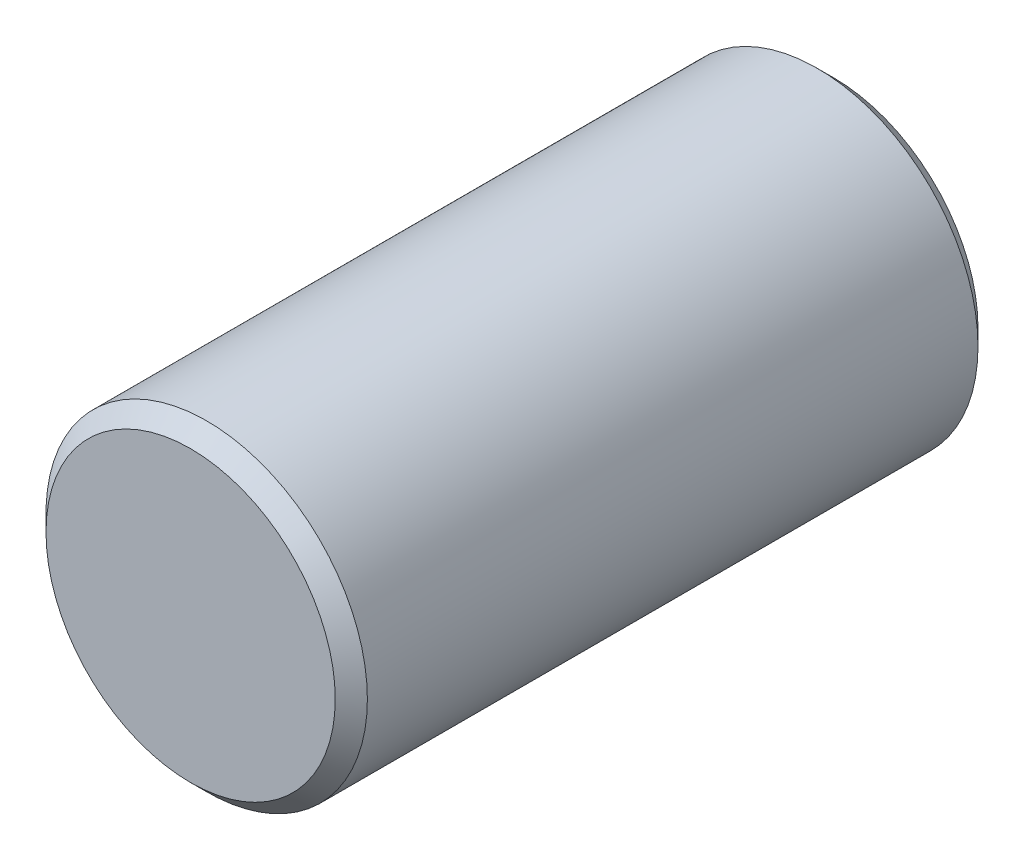
ISO-10303-21;
HEADER;
FILE_DESCRIPTION(('STEP AP214'),'2;1');
FILE_NAME('part.step','',(''),(''),'','','');
FILE_SCHEMA(('AUTOMOTIVE_DESIGN { 1 0 10303 214 1 1 1 1 }'));
ENDSEC;
DATA;
#1=APPLICATION_CONTEXT('core data for automotive mechanical design processes');
#2=APPLICATION_PROTOCOL_DEFINITION('international standard','automotive_design',2000,#1);
#3=PRODUCT_CONTEXT('',#1,'mechanical');
#4=PRODUCT('Part','Part','',(#3));
#5=PRODUCT_RELATED_PRODUCT_CATEGORY('part','',(#4));
#6=PRODUCT_DEFINITION_FORMATION('','',#4);
#7=PRODUCT_DEFINITION_CONTEXT('part definition',#1,'design');
#8=PRODUCT_DEFINITION('design','',#6,#7);
#9=PRODUCT_DEFINITION_SHAPE('','',#8);
#10=(LENGTH_UNIT() NAMED_UNIT(*) SI_UNIT(.MILLI.,.METRE.));
#11=(NAMED_UNIT(*) PLANE_ANGLE_UNIT() SI_UNIT($,.RADIAN.));
#12=(NAMED_UNIT(*) SI_UNIT($,.STERADIAN.) SOLID_ANGLE_UNIT());
#13=UNCERTAINTY_MEASURE_WITH_UNIT(LENGTH_MEASURE(1.E-05),#10,'distance_accuracy_value','');
#14=(GEOMETRIC_REPRESENTATION_CONTEXT(3) GLOBAL_UNCERTAINTY_ASSIGNED_CONTEXT((#13)) GLOBAL_UNIT_ASSIGNED_CONTEXT((#10,
#11,#12)) REPRESENTATION_CONTEXT('',''));
#15=CARTESIAN_POINT('',(0.,0.,0.));
#16=DIRECTION('',(0.,0.,1.));
#17=DIRECTION('',(1.,0.,0.));
#18=AXIS2_PLACEMENT_3D('',#15,#16,#17);
#19=CARTESIAN_POINT('',(0.,0.,4.));
#20=DIRECTION('',(0.,0.,-1.));
#21=DIRECTION('',(-1.,0.,0.));
#22=AXIS2_PLACEMENT_3D('',#19,#20,#21);
#23=CYLINDRICAL_SURFACE('',#22,2.);
#24=CARTESIAN_POINT('',(0.,0.,-3.8));
#25=DIRECTION('',(0.,0.,1.));
#26=DIRECTION('',(1.,0.,0.));
#27=AXIS2_PLACEMENT_3D('',#24,#25,#26);
#28=CIRCLE('',#27,2.);
#29=CARTESIAN_POINT('',(2.,0.,-3.8));
#30=VERTEX_POINT('',#29);
#31=EDGE_CURVE('E47',#30,#30,#28,.T.);
#32=ORIENTED_EDGE('',*,*,#31,.T.);
#33=EDGE_LOOP('',(#32));
#34=FACE_BOUND('',#33,.T.);
#35=CARTESIAN_POINT('',(0.,0.,3.8));
#36=DIRECTION('',(0.,0.,1.));
#37=DIRECTION('',(1.,0.,0.));
#38=AXIS2_PLACEMENT_3D('',#35,#36,#37);
#39=CIRCLE('',#38,2.);
#40=CARTESIAN_POINT('',(2.,0.,3.8));
#41=VERTEX_POINT('',#40);
#42=EDGE_CURVE('E51',#41,#41,#39,.F.);
#43=ORIENTED_EDGE('',*,*,#42,.T.);
#44=EDGE_LOOP('',(#43));
#45=FACE_BOUND('',#44,.T.);
#46=ADVANCED_FACE('F35',(#34,#45),#23,.T.);
#47=CARTESIAN_POINT('',(0.,0.,4.));
#48=DIRECTION('',(0.,0.,1.));
#49=DIRECTION('',(1.,0.,0.));
#50=AXIS2_PLACEMENT_3D('',#47,#48,#49);
#51=PLANE('',#50);
#52=CARTESIAN_POINT('',(0.,0.,4.));
#53=DIRECTION('',(0.,0.,1.));
#54=DIRECTION('',(1.,0.,0.));
#55=AXIS2_PLACEMENT_3D('',#52,#53,#54);
#56=CIRCLE('',#55,1.8);
#57=CARTESIAN_POINT('',(1.8,0.,4.));
#58=VERTEX_POINT('',#57);
#59=EDGE_CURVE('E10',#58,#58,#56,.T.);
#60=ORIENTED_EDGE('',*,*,#59,.T.);
#61=EDGE_LOOP('',(#60));
#62=FACE_BOUND('',#61,.T.);
#63=ADVANCED_FACE('F67',(#62),#51,.T.);
#64=CARTESIAN_POINT('',(0.,0.,-4.));
#65=DIRECTION('',(0.,0.,1.));
#66=DIRECTION('',(1.,0.,0.));
#67=AXIS2_PLACEMENT_3D('',#64,#65,#66);
#68=PLANE('',#67);
#69=CARTESIAN_POINT('',(0.,0.,-4.));
#70=DIRECTION('',(0.,0.,1.));
#71=DIRECTION('',(1.,0.,0.));
#72=AXIS2_PLACEMENT_3D('',#69,#70,#71);
#73=CIRCLE('',#72,1.8);
#74=CARTESIAN_POINT('',(1.8,0.,-4.));
#75=VERTEX_POINT('',#74);
#76=EDGE_CURVE('E43',#75,#75,#73,.F.);
#77=ORIENTED_EDGE('',*,*,#76,.T.);
#78=EDGE_LOOP('',(#77));
#79=FACE_BOUND('',#78,.T.);
#80=ADVANCED_FACE('F64',(#79),#68,.F.);
#81=CARTESIAN_POINT('',(0.,0.,-3.8));
#82=DIRECTION('',(0.,0.,1.));
#83=DIRECTION('',(1.,0.,0.));
#84=AXIS2_PLACEMENT_3D('',#81,#82,#83);
#85=CONICAL_SURFACE('',#84,2.,0.785398163397448);
#86=ORIENTED_EDGE('',*,*,#76,.F.);
#87=EDGE_LOOP('',(#86));
#88=FACE_BOUND('',#87,.T.);
#89=ORIENTED_EDGE('',*,*,#31,.F.);
#90=EDGE_LOOP('',(#89));
#91=FACE_BOUND('',#90,.T.);
#92=ADVANCED_FACE('F60',(#88,#91),#85,.T.);
#93=CARTESIAN_POINT('',(0.,0.,4.));
#94=DIRECTION('',(0.,0.,-1.));
#95=DIRECTION('',(-1.,0.,0.));
#96=AXIS2_PLACEMENT_3D('',#93,#94,#95);
#97=CONICAL_SURFACE('',#96,1.8,0.78539816339745);
#98=ORIENTED_EDGE('',*,*,#42,.F.);
#99=EDGE_LOOP('',(#98));
#100=FACE_BOUND('',#99,.T.);
#101=ORIENTED_EDGE('',*,*,#59,.F.);
#102=EDGE_LOOP('',(#101));
#103=FACE_BOUND('',#102,.T.);
#104=ADVANCED_FACE('F38',(#100,#103),#97,.T.);
#105=CLOSED_SHELL('',(#46,#63,#80,#92,#104));
#106=MANIFOLD_SOLID_BREP('B2',#105);
#107=ADVANCED_BREP_SHAPE_REPRESENTATION('',(#18,#106),#14);
#108=SHAPE_DEFINITION_REPRESENTATION(#9,#107);
ENDSEC;
END-ISO-10303-21;
